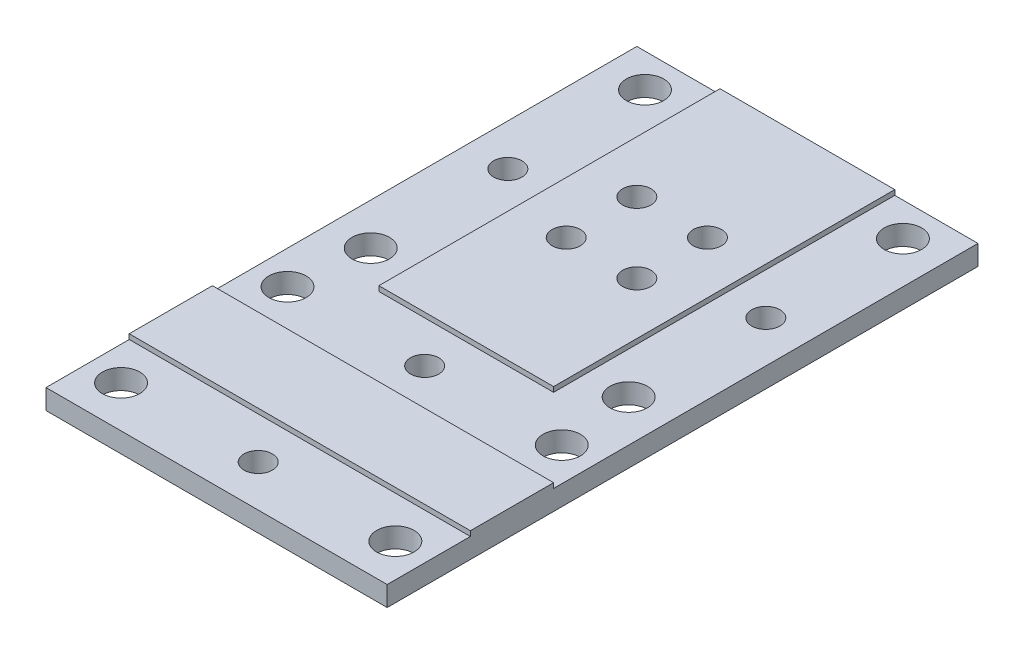
ISO-10303-21;
HEADER;
FILE_DESCRIPTION(('STEP AP214'),'2;1');
FILE_NAME('part.step','',(''),(''),'','','');
FILE_SCHEMA(('AUTOMOTIVE_DESIGN { 1 0 10303 214 1 1 1 1 }'));
ENDSEC;
DATA;
#1=APPLICATION_CONTEXT('core data for automotive mechanical design processes');
#2=APPLICATION_PROTOCOL_DEFINITION('international standard','automotive_design',2000,#1);
#3=PRODUCT_CONTEXT('',#1,'mechanical');
#4=PRODUCT('Part','Part','',(#3));
#5=PRODUCT_RELATED_PRODUCT_CATEGORY('part','',(#4));
#6=PRODUCT_DEFINITION_FORMATION('','',#4);
#7=PRODUCT_DEFINITION_CONTEXT('part definition',#1,'design');
#8=PRODUCT_DEFINITION('design','',#6,#7);
#9=PRODUCT_DEFINITION_SHAPE('','',#8);
#10=(LENGTH_UNIT() NAMED_UNIT(*) SI_UNIT(.MILLI.,.METRE.));
#11=(NAMED_UNIT(*) PLANE_ANGLE_UNIT() SI_UNIT($,.RADIAN.));
#12=(NAMED_UNIT(*) SI_UNIT($,.STERADIAN.) SOLID_ANGLE_UNIT());
#13=UNCERTAINTY_MEASURE_WITH_UNIT(LENGTH_MEASURE(1.E-05),#10,'distance_accuracy_value','');
#14=(GEOMETRIC_REPRESENTATION_CONTEXT(3) GLOBAL_UNCERTAINTY_ASSIGNED_CONTEXT((#13)) GLOBAL_UNIT_ASSIGNED_CONTEXT((#10,
#11,#12)) REPRESENTATION_CONTEXT('',''));
#15=CARTESIAN_POINT('',(0.,0.,0.));
#16=DIRECTION('',(0.,0.,1.));
#17=DIRECTION('',(1.,0.,0.));
#18=AXIS2_PLACEMENT_3D('',#15,#16,#17);
#19=CARTESIAN_POINT('',(0.,3.,0.));
#20=DIRECTION('',(0.,-1.,0.));
#21=DIRECTION('',(0.,0.,-1.));
#22=AXIS2_PLACEMENT_3D('',#19,#20,#21);
#23=PLANE('',#22);
#24=CARTESIAN_POINT('',(16.2573593128808,3.,-46.2573593128808));
#25=DIRECTION('',(0.,1.,0.));
#26=DIRECTION('',(0.,0.,1.));
#27=AXIS2_PLACEMENT_3D('',#24,#25,#26);
#28=CIRCLE('',#27,1.69999999999999);
#29=CARTESIAN_POINT('',(16.2573593128808,3.,-44.5573593128808));
#30=VERTEX_POINT('',#29);
#31=EDGE_CURVE('E441',#30,#30,#28,.T.);
#32=ORIENTED_EDGE('',*,*,#31,.F.);
#33=EDGE_LOOP('',(#32));
#34=FACE_BOUND('',#33,.T.);
#35=CARTESIAN_POINT('',(16.2573593128807,3.,-54.7426406871193));
#36=DIRECTION('',(0.,1.,0.));
#37=DIRECTION('',(0.,0.,1.));
#38=AXIS2_PLACEMENT_3D('',#35,#36,#37);
#39=CIRCLE('',#38,1.69999999999999);
#40=CARTESIAN_POINT('',(16.2573593128807,3.,-53.0426406871193));
#41=VERTEX_POINT('',#40);
#42=EDGE_CURVE('E443',#41,#41,#39,.T.);
#43=ORIENTED_EDGE('',*,*,#42,.F.);
#44=EDGE_LOOP('',(#43));
#45=FACE_BOUND('',#44,.T.);
#46=CARTESIAN_POINT('',(24.7426406871193,3.,-54.7426406871194));
#47=DIRECTION('',(0.,1.,0.));
#48=DIRECTION('',(0.,0.,1.));
#49=AXIS2_PLACEMENT_3D('',#46,#47,#48);
#50=CIRCLE('',#49,1.69999999999999);
#51=CARTESIAN_POINT('',(24.7426406871193,3.,-53.0426406871194));
#52=VERTEX_POINT('',#51);
#53=EDGE_CURVE('E451',#52,#52,#50,.T.);
#54=ORIENTED_EDGE('',*,*,#53,.F.);
#55=EDGE_LOOP('',(#54));
#56=FACE_BOUND('',#55,.T.);
#57=CARTESIAN_POINT('',(24.7426406871194,3.,-46.2573593128808));
#58=DIRECTION('',(0.,1.,0.));
#59=DIRECTION('',(0.,0.,1.));
#60=AXIS2_PLACEMENT_3D('',#57,#58,#59);
#61=CIRCLE('',#60,1.69999999999999);
#62=CARTESIAN_POINT('',(24.7426406871194,3.,-44.5573593128808));
#63=VERTEX_POINT('',#62);
#64=EDGE_CURVE('E457',#63,#63,#61,.T.);
#65=ORIENTED_EDGE('',*,*,#64,.F.);
#66=EDGE_LOOP('',(#65));
#67=FACE_BOUND('',#66,.T.);
#68=DIRECTION('',(-1.,0.,0.));
#69=VECTOR('',#68,1.);
#70=CARTESIAN_POINT('',(0.,3.,-71.));
#71=LINE('',#70,#69);
#72=CARTESIAN_POINT('',(31.,3.,-71.));
#73=VERTEX_POINT('',#72);
#74=CARTESIAN_POINT('',(10.,3.,-71.));
#75=VERTEX_POINT('',#74);
#76=EDGE_CURVE('E175',#73,#75,#71,.T.);
#77=ORIENTED_EDGE('',*,*,#76,.T.);
#78=DIRECTION('',(0.,0.,-1.));
#79=VECTOR('',#78,1.);
#80=CARTESIAN_POINT('',(10.,3.,-71.));
#81=LINE('',#80,#79);
#82=CARTESIAN_POINT('',(10.,3.,-30.));
#83=VERTEX_POINT('',#82);
#84=EDGE_CURVE('E137',#83,#75,#81,.T.);
#85=ORIENTED_EDGE('',*,*,#84,.F.);
#86=DIRECTION('',(-1.,0.,0.));
#87=VECTOR('',#86,1.);
#88=CARTESIAN_POINT('',(31.,3.,-30.));
#89=LINE('',#88,#87);
#90=CARTESIAN_POINT('',(31.,3.,-30.));
#91=VERTEX_POINT('',#90);
#92=EDGE_CURVE('E282',#91,#83,#89,.T.);
#93=ORIENTED_EDGE('',*,*,#92,.F.);
#94=DIRECTION('',(0.,0.,1.));
#95=VECTOR('',#94,1.);
#96=CARTESIAN_POINT('',(31.,3.,-71.));
#97=LINE('',#96,#95);
#98=EDGE_CURVE('E279',#73,#91,#97,.T.);
#99=ORIENTED_EDGE('',*,*,#98,.F.);
#100=EDGE_LOOP('',(#77,#85,#93,#99));
#101=FACE_BOUND('',#100,.T.);
#102=ADVANCED_FACE('F35',(#34,#45,#56,#67,#101),#23,.F.);
#103=CARTESIAN_POINT('',(0.,3.,0.));
#104=DIRECTION('',(1.,0.,0.));
#105=DIRECTION('',(0.,0.,-1.));
#106=AXIS2_PLACEMENT_3D('',#103,#104,#105);
#107=PLANE('',#106);
#108=DIRECTION('',(0.,0.,1.));
#109=VECTOR('',#108,1.);
#110=CARTESIAN_POINT('',(0.,3.,0.));
#111=LINE('',#110,#109);
#112=CARTESIAN_POINT('',(0.,3.,-20.));
#113=VERTEX_POINT('',#112);
#114=CARTESIAN_POINT('',(0.,3.,-9.99999999999999));
#115=VERTEX_POINT('',#114);
#116=EDGE_CURVE('E146',#113,#115,#111,.T.);
#117=ORIENTED_EDGE('',*,*,#116,.F.);
#118=DIRECTION('',(0.,1.,0.));
#119=VECTOR('',#118,1.);
#120=CARTESIAN_POINT('',(0.,2.4,-20.));
#121=LINE('',#120,#119);
#122=CARTESIAN_POINT('',(0.,2.4,-20.));
#123=VERTEX_POINT('',#122);
#124=EDGE_CURVE('E52',#123,#113,#121,.T.);
#125=ORIENTED_EDGE('',*,*,#124,.F.);
#126=DIRECTION('',(0.,0.,1.));
#127=VECTOR('',#126,1.);
#128=CARTESIAN_POINT('',(0.,2.4,-30.));
#129=LINE('',#128,#127);
#130=CARTESIAN_POINT('',(0.,2.4,-71.));
#131=VERTEX_POINT('',#130);
#132=EDGE_CURVE('E128',#131,#123,#129,.T.);
#133=ORIENTED_EDGE('',*,*,#132,.F.);
#134=DIRECTION('',(0.,-1.,0.));
#135=VECTOR('',#134,1.);
#136=CARTESIAN_POINT('',(0.,3.,-71.));
#137=LINE('',#136,#135);
#138=CARTESIAN_POINT('',(0.,0.,-71.));
#139=VERTEX_POINT('',#138);
#140=EDGE_CURVE('E178',#131,#139,#137,.T.);
#141=ORIENTED_EDGE('',*,*,#140,.T.);
#142=DIRECTION('',(0.,0.,1.));
#143=VECTOR('',#142,1.);
#144=CARTESIAN_POINT('',(0.,0.,0.));
#145=LINE('',#144,#143);
#146=CARTESIAN_POINT('',(0.,0.,0.));
#147=VERTEX_POINT('',#146);
#148=EDGE_CURVE('E168',#139,#147,#145,.T.);
#149=ORIENTED_EDGE('',*,*,#148,.T.);
#150=DIRECTION('',(0.,-1.,0.));
#151=VECTOR('',#150,1.);
#152=CARTESIAN_POINT('',(0.,3.,0.));
#153=LINE('',#152,#151);
#154=CARTESIAN_POINT('',(0.,2.4,0.));
#155=VERTEX_POINT('',#154);
#156=EDGE_CURVE('E11',#155,#147,#153,.T.);
#157=ORIENTED_EDGE('',*,*,#156,.F.);
#158=DIRECTION('',(0.,0.,1.));
#159=VECTOR('',#158,1.);
#160=CARTESIAN_POINT('',(0.,2.4,0.));
#161=LINE('',#160,#159);
#162=CARTESIAN_POINT('',(0.,2.4,-9.99999999999999));
#163=VERTEX_POINT('',#162);
#164=EDGE_CURVE('E154',#163,#155,#161,.T.);
#165=ORIENTED_EDGE('',*,*,#164,.F.);
#166=DIRECTION('',(0.,1.,0.));
#167=VECTOR('',#166,1.);
#168=CARTESIAN_POINT('',(0.,2.4,-9.99999999999999));
#169=LINE('',#168,#167);
#170=EDGE_CURVE('E166',#163,#115,#169,.T.);
#171=ORIENTED_EDGE('',*,*,#170,.T.);
#172=EDGE_LOOP('',(#117,#125,#133,#141,#149,#157,#165,#171));
#173=FACE_BOUND('',#172,.T.);
#174=ADVANCED_FACE('F37',(#173),#107,.F.);
#175=CARTESIAN_POINT('',(0.,3.,0.));
#176=DIRECTION('',(0.,0.,-1.));
#177=DIRECTION('',(-1.,0.,0.));
#178=AXIS2_PLACEMENT_3D('',#175,#176,#177);
#179=PLANE('',#178);
#180=DIRECTION('',(0.,-1.,0.));
#181=VECTOR('',#180,1.);
#182=CARTESIAN_POINT('',(41.,3.,0.));
#183=LINE('',#182,#181);
#184=CARTESIAN_POINT('',(41.,2.4,0.));
#185=VERTEX_POINT('',#184);
#186=CARTESIAN_POINT('',(41.,0.,0.));
#187=VERTEX_POINT('',#186);
#188=EDGE_CURVE('E44',#185,#187,#183,.T.);
#189=ORIENTED_EDGE('',*,*,#188,.F.);
#190=DIRECTION('',(1.,0.,0.));
#191=VECTOR('',#190,1.);
#192=CARTESIAN_POINT('',(41.,2.4,0.));
#193=LINE('',#192,#191);
#194=EDGE_CURVE('E156',#155,#185,#193,.T.);
#195=ORIENTED_EDGE('',*,*,#194,.F.);
#196=ORIENTED_EDGE('',*,*,#156,.T.);
#197=DIRECTION('',(1.,0.,0.));
#198=VECTOR('',#197,1.);
#199=CARTESIAN_POINT('',(0.,0.,0.));
#200=LINE('',#199,#198);
#201=EDGE_CURVE('E181',#147,#187,#200,.T.);
#202=ORIENTED_EDGE('',*,*,#201,.T.);
#203=EDGE_LOOP('',(#189,#195,#196,#202));
#204=FACE_BOUND('',#203,.T.);
#205=ADVANCED_FACE('F324',(#204),#179,.F.);
#206=CARTESIAN_POINT('',(41.,3.,0.));
#207=DIRECTION('',(-1.,0.,0.));
#208=DIRECTION('',(0.,0.,1.));
#209=AXIS2_PLACEMENT_3D('',#206,#207,#208);
#210=PLANE('',#209);
#211=DIRECTION('',(0.,0.,-1.));
#212=VECTOR('',#211,1.);
#213=CARTESIAN_POINT('',(41.,2.4,-20.));
#214=LINE('',#213,#212);
#215=CARTESIAN_POINT('',(41.,2.4,-20.));
#216=VERTEX_POINT('',#215);
#217=CARTESIAN_POINT('',(41.,2.4,-71.));
#218=VERTEX_POINT('',#217);
#219=EDGE_CURVE('E142',#216,#218,#214,.T.);
#220=ORIENTED_EDGE('',*,*,#219,.F.);
#221=DIRECTION('',(0.,1.,0.));
#222=VECTOR('',#221,1.);
#223=CARTESIAN_POINT('',(41.,2.4,-20.));
#224=LINE('',#223,#222);
#225=CARTESIAN_POINT('',(41.,3.,-20.));
#226=VERTEX_POINT('',#225);
#227=EDGE_CURVE('E141',#216,#226,#224,.T.);
#228=ORIENTED_EDGE('',*,*,#227,.T.);
#229=DIRECTION('',(0.,0.,-1.));
#230=VECTOR('',#229,1.);
#231=CARTESIAN_POINT('',(41.,3.,0.));
#232=LINE('',#231,#230);
#233=CARTESIAN_POINT('',(41.,3.,-9.99999999999999));
#234=VERTEX_POINT('',#233);
#235=EDGE_CURVE('E171',#234,#226,#232,.T.);
#236=ORIENTED_EDGE('',*,*,#235,.F.);
#237=DIRECTION('',(0.,1.,0.));
#238=VECTOR('',#237,1.);
#239=CARTESIAN_POINT('',(41.,2.4,-9.99999999999999));
#240=LINE('',#239,#238);
#241=CARTESIAN_POINT('',(41.,2.4,-9.99999999999999));
#242=VERTEX_POINT('',#241);
#243=EDGE_CURVE('E60',#242,#234,#240,.T.);
#244=ORIENTED_EDGE('',*,*,#243,.F.);
#245=DIRECTION('',(0.,0.,-1.));
#246=VECTOR('',#245,1.);
#247=CARTESIAN_POINT('',(41.,2.4,-9.99999999999999));
#248=LINE('',#247,#246);
#249=EDGE_CURVE('E159',#185,#242,#248,.T.);
#250=ORIENTED_EDGE('',*,*,#249,.F.);
#251=ORIENTED_EDGE('',*,*,#188,.T.);
#252=DIRECTION('',(0.,0.,-1.));
#253=VECTOR('',#252,1.);
#254=CARTESIAN_POINT('',(41.,0.,0.));
#255=LINE('',#254,#253);
#256=CARTESIAN_POINT('',(41.,0.,-71.));
#257=VERTEX_POINT('',#256);
#258=EDGE_CURVE('E184',#187,#257,#255,.T.);
#259=ORIENTED_EDGE('',*,*,#258,.T.);
#260=DIRECTION('',(0.,-1.,0.));
#261=VECTOR('',#260,1.);
#262=CARTESIAN_POINT('',(41.,3.,-71.));
#263=LINE('',#262,#261);
#264=EDGE_CURVE('E190',#218,#257,#263,.T.);
#265=ORIENTED_EDGE('',*,*,#264,.F.);
#266=EDGE_LOOP('',(#220,#228,#236,#244,#250,#251,#259,#265));
#267=FACE_BOUND('',#266,.T.);
#268=ADVANCED_FACE('F338',(#267),#210,.F.);
#269=CARTESIAN_POINT('',(0.,3.,-71.));
#270=DIRECTION('',(0.,0.,1.));
#271=DIRECTION('',(1.,0.,0.));
#272=AXIS2_PLACEMENT_3D('',#269,#270,#271);
#273=PLANE('',#272);
#274=DIRECTION('',(-1.,0.,0.));
#275=VECTOR('',#274,1.);
#276=CARTESIAN_POINT('',(0.,2.4,-71.));
#277=LINE('',#276,#275);
#278=CARTESIAN_POINT('',(10.,2.4,-71.));
#279=VERTEX_POINT('',#278);
#280=EDGE_CURVE('E134',#279,#131,#277,.T.);
#281=ORIENTED_EDGE('',*,*,#280,.F.);
#282=DIRECTION('',(0.,1.,0.));
#283=VECTOR('',#282,1.);
#284=CARTESIAN_POINT('',(10.,2.4,-71.));
#285=LINE('',#284,#283);
#286=EDGE_CURVE('E165',#279,#75,#285,.T.);
#287=ORIENTED_EDGE('',*,*,#286,.T.);
#288=ORIENTED_EDGE('',*,*,#76,.F.);
#289=DIRECTION('',(0.,1.,0.));
#290=VECTOR('',#289,1.);
#291=CARTESIAN_POINT('',(31.,2.4,-71.));
#292=LINE('',#291,#290);
#293=CARTESIAN_POINT('',(31.,2.4,-71.));
#294=VERTEX_POINT('',#293);
#295=EDGE_CURVE('E148',#294,#73,#292,.T.);
#296=ORIENTED_EDGE('',*,*,#295,.F.);
#297=DIRECTION('',(-1.,0.,0.));
#298=VECTOR('',#297,1.);
#299=CARTESIAN_POINT('',(41.,2.4,-71.));
#300=LINE('',#299,#298);
#301=EDGE_CURVE('E268',#218,#294,#300,.T.);
#302=ORIENTED_EDGE('',*,*,#301,.F.);
#303=ORIENTED_EDGE('',*,*,#264,.T.);
#304=DIRECTION('',(-1.,0.,0.));
#305=VECTOR('',#304,1.);
#306=CARTESIAN_POINT('',(0.,0.,-71.));
#307=LINE('',#306,#305);
#308=EDGE_CURVE('E172',#257,#139,#307,.T.);
#309=ORIENTED_EDGE('',*,*,#308,.T.);
#310=ORIENTED_EDGE('',*,*,#140,.F.);
#311=EDGE_LOOP('',(#281,#287,#288,#296,#302,#303,#309,#310));
#312=FACE_BOUND('',#311,.T.);
#313=ADVANCED_FACE('F301',(#312),#273,.F.);
#314=ORIENTED_EDGE('',*,*,#235,.T.);
#315=DIRECTION('',(1.,0.,0.));
#316=VECTOR('',#315,1.);
#317=CARTESIAN_POINT('',(0.,3.,-20.));
#318=LINE('',#317,#316);
#319=EDGE_CURVE('E196',#113,#226,#318,.T.);
#320=ORIENTED_EDGE('',*,*,#319,.F.);
#321=ORIENTED_EDGE('',*,*,#116,.T.);
#322=DIRECTION('',(-1.,0.,0.));
#323=VECTOR('',#322,1.);
#324=CARTESIAN_POINT('',(0.,3.,-9.99999999999999));
#325=LINE('',#324,#323);
#326=EDGE_CURVE('E157',#234,#115,#325,.T.);
#327=ORIENTED_EDGE('',*,*,#326,.F.);
#328=EDGE_LOOP('',(#314,#320,#321,#327));
#329=FACE_BOUND('',#328,.T.);
#330=ADVANCED_FACE('F320',(#329),#23,.F.);
#331=CARTESIAN_POINT('',(0.,0.,0.));
#332=DIRECTION('',(0.,-1.,0.));
#333=DIRECTION('',(0.,0.,-1.));
#334=AXIS2_PLACEMENT_3D('',#331,#332,#333);
#335=PLANE('',#334);
#336=CARTESIAN_POINT('',(16.2573593128808,0.,-46.2573593128808));
#337=DIRECTION('',(0.,1.,0.));
#338=DIRECTION('',(0.,0.,1.));
#339=AXIS2_PLACEMENT_3D('',#336,#337,#338);
#340=CIRCLE('',#339,1.7);
#341=CARTESIAN_POINT('',(16.2573593128808,0.,-44.5573593128808));
#342=VERTEX_POINT('',#341);
#343=EDGE_CURVE('E439',#342,#342,#340,.T.);
#344=ORIENTED_EDGE('',*,*,#343,.T.);
#345=EDGE_LOOP('',(#344));
#346=FACE_BOUND('',#345,.T.);
#347=CARTESIAN_POINT('',(16.2573593128807,0.,-54.7426406871193));
#348=DIRECTION('',(0.,1.,0.));
#349=DIRECTION('',(0.,0.,1.));
#350=AXIS2_PLACEMENT_3D('',#347,#348,#349);
#351=CIRCLE('',#350,1.7);
#352=CARTESIAN_POINT('',(16.2573593128807,0.,-53.0426406871193));
#353=VERTEX_POINT('',#352);
#354=EDGE_CURVE('E448',#353,#353,#351,.T.);
#355=ORIENTED_EDGE('',*,*,#354,.T.);
#356=EDGE_LOOP('',(#355));
#357=FACE_BOUND('',#356,.T.);
#358=CARTESIAN_POINT('',(24.7426406871193,0.,-54.7426406871194));
#359=DIRECTION('',(0.,1.,0.));
#360=DIRECTION('',(0.,0.,1.));
#361=AXIS2_PLACEMENT_3D('',#358,#359,#360);
#362=CIRCLE('',#361,1.7);
#363=CARTESIAN_POINT('',(24.7426406871193,0.,-53.0426406871194));
#364=VERTEX_POINT('',#363);
#365=EDGE_CURVE('E454',#364,#364,#362,.T.);
#366=ORIENTED_EDGE('',*,*,#365,.T.);
#367=EDGE_LOOP('',(#366));
#368=FACE_BOUND('',#367,.T.);
#369=CARTESIAN_POINT('',(24.7426406871194,0.,-46.2573593128808));
#370=DIRECTION('',(0.,1.,0.));
#371=DIRECTION('',(0.,0.,1.));
#372=AXIS2_PLACEMENT_3D('',#369,#370,#371);
#373=CIRCLE('',#372,1.7);
#374=CARTESIAN_POINT('',(24.7426406871194,0.,-44.5573593128808));
#375=VERTEX_POINT('',#374);
#376=EDGE_CURVE('E459',#375,#375,#373,.T.);
#377=ORIENTED_EDGE('',*,*,#376,.T.);
#378=EDGE_LOOP('',(#377));
#379=FACE_BOUND('',#378,.T.);
#380=CARTESIAN_POINT('',(20.5,0.,-5.));
#381=DIRECTION('',(0.,1.,0.));
#382=DIRECTION('',(0.,0.,1.));
#383=AXIS2_PLACEMENT_3D('',#380,#381,#382);
#384=CIRCLE('',#383,1.7);
#385=CARTESIAN_POINT('',(20.5,0.,-3.3));
#386=VERTEX_POINT('',#385);
#387=EDGE_CURVE('E239',#386,#386,#384,.T.);
#388=ORIENTED_EDGE('',*,*,#387,.T.);
#389=EDGE_LOOP('',(#388));
#390=FACE_BOUND('',#389,.T.);
#391=CARTESIAN_POINT('',(20.5,0.,-25.));
#392=DIRECTION('',(0.,1.,0.));
#393=DIRECTION('',(0.,0.,1.));
#394=AXIS2_PLACEMENT_3D('',#391,#392,#393);
#395=CIRCLE('',#394,1.7);
#396=CARTESIAN_POINT('',(20.5,0.,-23.3));
#397=VERTEX_POINT('',#396);
#398=EDGE_CURVE('E229',#397,#397,#395,.T.);
#399=ORIENTED_EDGE('',*,*,#398,.T.);
#400=EDGE_LOOP('',(#399));
#401=FACE_BOUND('',#400,.T.);
#402=CARTESIAN_POINT('',(4.99999999999999,0.,-50.5));
#403=DIRECTION('',(0.,1.,0.));
#404=DIRECTION('',(0.,0.,1.));
#405=AXIS2_PLACEMENT_3D('',#402,#403,#404);
#406=CIRCLE('',#405,1.7);
#407=CARTESIAN_POINT('',(4.99999999999999,0.,-48.8));
#408=VERTEX_POINT('',#407);
#409=EDGE_CURVE('E226',#408,#408,#406,.T.);
#410=ORIENTED_EDGE('',*,*,#409,.T.);
#411=EDGE_LOOP('',(#410));
#412=FACE_BOUND('',#411,.T.);
#413=CARTESIAN_POINT('',(36.,0.,-50.5));
#414=DIRECTION('',(0.,1.,0.));
#415=DIRECTION('',(0.,0.,1.));
#416=AXIS2_PLACEMENT_3D('',#413,#414,#415);
#417=CIRCLE('',#416,1.7);
#418=CARTESIAN_POINT('',(36.,0.,-48.8));
#419=VERTEX_POINT('',#418);
#420=EDGE_CURVE('E223',#419,#419,#417,.T.);
#421=ORIENTED_EDGE('',*,*,#420,.T.);
#422=EDGE_LOOP('',(#421));
#423=FACE_BOUND('',#422,.T.);
#424=CARTESIAN_POINT('',(4.02003210281144,0.,-5.));
#425=DIRECTION('',(0.,1.,0.));
#426=DIRECTION('',(0.,0.,1.));
#427=AXIS2_PLACEMENT_3D('',#424,#425,#426);
#428=CIRCLE('',#427,2.25);
#429=CARTESIAN_POINT('',(4.02003210281144,0.,-2.75));
#430=VERTEX_POINT('',#429);
#431=EDGE_CURVE('E219',#430,#430,#428,.T.);
#432=ORIENTED_EDGE('',*,*,#431,.T.);
#433=EDGE_LOOP('',(#432));
#434=FACE_BOUND('',#433,.T.);
#435=CARTESIAN_POINT('',(36.9799678971886,0.,-5.));
#436=DIRECTION('',(0.,1.,0.));
#437=DIRECTION('',(0.,0.,1.));
#438=AXIS2_PLACEMENT_3D('',#435,#436,#437);
#439=CIRCLE('',#438,2.25);
#440=CARTESIAN_POINT('',(36.9799678971886,0.,-2.75));
#441=VERTEX_POINT('',#440);
#442=EDGE_CURVE('E218',#441,#441,#439,.T.);
#443=ORIENTED_EDGE('',*,*,#442,.T.);
#444=EDGE_LOOP('',(#443));
#445=FACE_BOUND('',#444,.T.);
#446=CARTESIAN_POINT('',(36.9799678971886,0.,-25.));
#447=DIRECTION('',(0.,1.,0.));
#448=DIRECTION('',(0.,0.,1.));
#449=AXIS2_PLACEMENT_3D('',#446,#447,#448);
#450=CIRCLE('',#449,2.25);
#451=CARTESIAN_POINT('',(36.9799678971886,0.,-22.75));
#452=VERTEX_POINT('',#451);
#453=EDGE_CURVE('E214',#452,#452,#450,.T.);
#454=ORIENTED_EDGE('',*,*,#453,.T.);
#455=EDGE_LOOP('',(#454));
#456=FACE_BOUND('',#455,.T.);
#457=CARTESIAN_POINT('',(4.02003210281143,0.,-25.));
#458=DIRECTION('',(0.,1.,0.));
#459=DIRECTION('',(0.,0.,1.));
#460=AXIS2_PLACEMENT_3D('',#457,#458,#459);
#461=CIRCLE('',#460,2.25);
#462=CARTESIAN_POINT('',(4.02003210281143,0.,-22.75));
#463=VERTEX_POINT('',#462);
#464=EDGE_CURVE('E210',#463,#463,#461,.T.);
#465=ORIENTED_EDGE('',*,*,#464,.T.);
#466=EDGE_LOOP('',(#465));
#467=FACE_BOUND('',#466,.T.);
#468=CARTESIAN_POINT('',(4.99999999999999,0.,-34.0200321028114));
#469=DIRECTION('',(0.,1.,0.));
#470=DIRECTION('',(0.,0.,1.));
#471=AXIS2_PLACEMENT_3D('',#468,#469,#470);
#472=CIRCLE('',#471,2.25);
#473=CARTESIAN_POINT('',(4.99999999999999,0.,-31.7700321028114));
#474=VERTEX_POINT('',#473);
#475=EDGE_CURVE('E206',#474,#474,#472,.T.);
#476=ORIENTED_EDGE('',*,*,#475,.T.);
#477=EDGE_LOOP('',(#476));
#478=FACE_BOUND('',#477,.T.);
#479=CARTESIAN_POINT('',(36.,0.,-34.0200321028114));
#480=DIRECTION('',(0.,1.,0.));
#481=DIRECTION('',(0.,0.,1.));
#482=AXIS2_PLACEMENT_3D('',#479,#480,#481);
#483=CIRCLE('',#482,2.25);
#484=CARTESIAN_POINT('',(36.,0.,-31.7700321028114));
#485=VERTEX_POINT('',#484);
#486=EDGE_CURVE('E205',#485,#485,#483,.T.);
#487=ORIENTED_EDGE('',*,*,#486,.T.);
#488=EDGE_LOOP('',(#487));
#489=FACE_BOUND('',#488,.T.);
#490=CARTESIAN_POINT('',(36.,0.,-66.9799678971886));
#491=DIRECTION('',(0.,1.,0.));
#492=DIRECTION('',(0.,0.,1.));
#493=AXIS2_PLACEMENT_3D('',#490,#491,#492);
#494=CIRCLE('',#493,2.25);
#495=CARTESIAN_POINT('',(36.,0.,-64.7299678971886));
#496=VERTEX_POINT('',#495);
#497=EDGE_CURVE('E201',#496,#496,#494,.T.);
#498=ORIENTED_EDGE('',*,*,#497,.T.);
#499=EDGE_LOOP('',(#498));
#500=FACE_BOUND('',#499,.T.);
#501=CARTESIAN_POINT('',(4.99999999999999,0.,-66.9799678971885));
#502=DIRECTION('',(0.,1.,0.));
#503=DIRECTION('',(0.,0.,1.));
#504=AXIS2_PLACEMENT_3D('',#501,#502,#503);
#505=CIRCLE('',#504,2.25);
#506=CARTESIAN_POINT('',(4.99999999999999,0.,-64.7299678971885));
#507=VERTEX_POINT('',#506);
#508=EDGE_CURVE('E197',#507,#507,#505,.T.);
#509=ORIENTED_EDGE('',*,*,#508,.T.);
#510=EDGE_LOOP('',(#509));
#511=FACE_BOUND('',#510,.T.);
#512=ORIENTED_EDGE('',*,*,#148,.F.);
#513=ORIENTED_EDGE('',*,*,#308,.F.);
#514=ORIENTED_EDGE('',*,*,#258,.F.);
#515=ORIENTED_EDGE('',*,*,#201,.F.);
#516=EDGE_LOOP('',(#512,#513,#514,#515));
#517=FACE_BOUND('',#516,.T.);
#518=ADVANCED_FACE('F330',(#346,#357,#368,#379,#390,#401,#412,#423,#434,#445,#456,#467,#478,
#489,#500,#511,#517),#335,.T.);
#519=CARTESIAN_POINT('',(0.,2.4,-9.99999999999999));
#520=DIRECTION('',(0.,0.,-1.));
#521=DIRECTION('',(-1.,0.,0.));
#522=AXIS2_PLACEMENT_3D('',#519,#520,#521);
#523=PLANE('',#522);
#524=ORIENTED_EDGE('',*,*,#326,.T.);
#525=ORIENTED_EDGE('',*,*,#170,.F.);
#526=DIRECTION('',(-1.,0.,0.));
#527=VECTOR('',#526,1.);
#528=CARTESIAN_POINT('',(0.,2.4,-9.99999999999999));
#529=LINE('',#528,#527);
#530=EDGE_CURVE('E161',#242,#163,#529,.T.);
#531=ORIENTED_EDGE('',*,*,#530,.F.);
#532=ORIENTED_EDGE('',*,*,#243,.T.);
#533=EDGE_LOOP('',(#524,#525,#531,#532));
#534=FACE_BOUND('',#533,.T.);
#535=ADVANCED_FACE('F336',(#534),#523,.F.);
#536=CARTESIAN_POINT('',(0.,2.4,0.));
#537=DIRECTION('',(0.,-1.,0.));
#538=DIRECTION('',(0.,0.,-1.));
#539=AXIS2_PLACEMENT_3D('',#536,#537,#538);
#540=PLANE('',#539);
#541=CARTESIAN_POINT('',(20.5,2.4,-5.));
#542=DIRECTION('',(0.,-1.,0.));
#543=DIRECTION('',(0.,0.,-1.));
#544=AXIS2_PLACEMENT_3D('',#541,#542,#543);
#545=CIRCLE('',#544,1.69999999999999);
#546=CARTESIAN_POINT('',(20.5,2.4,-6.7));
#547=VERTEX_POINT('',#546);
#548=EDGE_CURVE('E39',#547,#547,#545,.T.);
#549=ORIENTED_EDGE('',*,*,#548,.T.);
#550=EDGE_LOOP('',(#549));
#551=FACE_BOUND('',#550,.T.);
#552=CARTESIAN_POINT('',(4.02003210281144,2.4,-5.));
#553=DIRECTION('',(0.,-1.,0.));
#554=DIRECTION('',(0.,0.,-1.));
#555=AXIS2_PLACEMENT_3D('',#552,#553,#554);
#556=CIRCLE('',#555,2.24999999999999);
#557=CARTESIAN_POINT('',(4.02003210281144,2.4,-7.24999999999999));
#558=VERTEX_POINT('',#557);
#559=EDGE_CURVE('E215',#558,#558,#556,.T.);
#560=ORIENTED_EDGE('',*,*,#559,.T.);
#561=EDGE_LOOP('',(#560));
#562=FACE_BOUND('',#561,.T.);
#563=CARTESIAN_POINT('',(36.9799678971886,2.4,-5.));
#564=DIRECTION('',(0.,-1.,0.));
#565=DIRECTION('',(0.,0.,-1.));
#566=AXIS2_PLACEMENT_3D('',#563,#564,#565);
#567=CIRCLE('',#566,2.25);
#568=CARTESIAN_POINT('',(36.9799678971886,2.4,-7.25));
#569=VERTEX_POINT('',#568);
#570=EDGE_CURVE('E249',#569,#569,#567,.T.);
#571=ORIENTED_EDGE('',*,*,#570,.T.);
#572=EDGE_LOOP('',(#571));
#573=FACE_BOUND('',#572,.T.);
#574=ORIENTED_EDGE('',*,*,#164,.T.);
#575=ORIENTED_EDGE('',*,*,#194,.T.);
#576=ORIENTED_EDGE('',*,*,#249,.T.);
#577=ORIENTED_EDGE('',*,*,#530,.T.);
#578=EDGE_LOOP('',(#574,#575,#576,#577));
#579=FACE_BOUND('',#578,.T.);
#580=ADVANCED_FACE('F315',(#551,#562,#573,#579),#540,.F.);
#581=CARTESIAN_POINT('',(10.,2.4,-71.));
#582=DIRECTION('',(1.,0.,0.));
#583=DIRECTION('',(0.,0.,-1.));
#584=AXIS2_PLACEMENT_3D('',#581,#582,#583);
#585=PLANE('',#584);
#586=ORIENTED_EDGE('',*,*,#84,.T.);
#587=ORIENTED_EDGE('',*,*,#286,.F.);
#588=DIRECTION('',(0.,0.,-1.));
#589=VECTOR('',#588,1.);
#590=CARTESIAN_POINT('',(10.,2.4,-71.));
#591=LINE('',#590,#589);
#592=CARTESIAN_POINT('',(10.,2.4,-30.));
#593=VERTEX_POINT('',#592);
#594=EDGE_CURVE('E150',#593,#279,#591,.T.);
#595=ORIENTED_EDGE('',*,*,#594,.F.);
#596=DIRECTION('',(0.,1.,0.));
#597=VECTOR('',#596,1.);
#598=CARTESIAN_POINT('',(10.,2.4,-30.));
#599=LINE('',#598,#597);
#600=EDGE_CURVE('E288',#593,#83,#599,.T.);
#601=ORIENTED_EDGE('',*,*,#600,.T.);
#602=EDGE_LOOP('',(#586,#587,#595,#601));
#603=FACE_BOUND('',#602,.T.);
#604=ADVANCED_FACE('F304',(#603),#585,.F.);
#605=CARTESIAN_POINT('',(31.,2.4,-30.));
#606=DIRECTION('',(0.,0.,-1.));
#607=DIRECTION('',(-1.,0.,0.));
#608=AXIS2_PLACEMENT_3D('',#605,#606,#607);
#609=PLANE('',#608);
#610=ORIENTED_EDGE('',*,*,#92,.T.);
#611=ORIENTED_EDGE('',*,*,#600,.F.);
#612=DIRECTION('',(-1.,0.,0.));
#613=VECTOR('',#612,1.);
#614=CARTESIAN_POINT('',(31.,2.4,-30.));
#615=LINE('',#614,#613);
#616=CARTESIAN_POINT('',(31.,2.4,-30.));
#617=VERTEX_POINT('',#616);
#618=EDGE_CURVE('E274',#617,#593,#615,.T.);
#619=ORIENTED_EDGE('',*,*,#618,.F.);
#620=DIRECTION('',(0.,1.,0.));
#621=VECTOR('',#620,1.);
#622=CARTESIAN_POINT('',(31.,2.4,-30.));
#623=LINE('',#622,#621);
#624=EDGE_CURVE('E290',#617,#91,#623,.T.);
#625=ORIENTED_EDGE('',*,*,#624,.T.);
#626=EDGE_LOOP('',(#610,#611,#619,#625));
#627=FACE_BOUND('',#626,.T.);
#628=ADVANCED_FACE('F307',(#627),#609,.F.);
#629=CARTESIAN_POINT('',(31.,2.4,-71.));
#630=DIRECTION('',(-1.,0.,0.));
#631=DIRECTION('',(0.,0.,1.));
#632=AXIS2_PLACEMENT_3D('',#629,#630,#631);
#633=PLANE('',#632);
#634=ORIENTED_EDGE('',*,*,#98,.T.);
#635=ORIENTED_EDGE('',*,*,#624,.F.);
#636=DIRECTION('',(0.,0.,1.));
#637=VECTOR('',#636,1.);
#638=CARTESIAN_POINT('',(31.,2.4,-71.));
#639=LINE('',#638,#637);
#640=EDGE_CURVE('E271',#294,#617,#639,.T.);
#641=ORIENTED_EDGE('',*,*,#640,.F.);
#642=ORIENTED_EDGE('',*,*,#295,.T.);
#643=EDGE_LOOP('',(#634,#635,#641,#642));
#644=FACE_BOUND('',#643,.T.);
#645=ADVANCED_FACE('F294',(#644),#633,.F.);
#646=CARTESIAN_POINT('',(0.,2.4,-20.));
#647=DIRECTION('',(0.,0.,1.));
#648=DIRECTION('',(1.,0.,0.));
#649=AXIS2_PLACEMENT_3D('',#646,#647,#648);
#650=PLANE('',#649);
#651=ORIENTED_EDGE('',*,*,#319,.T.);
#652=ORIENTED_EDGE('',*,*,#227,.F.);
#653=DIRECTION('',(1.,0.,0.));
#654=VECTOR('',#653,1.);
#655=CARTESIAN_POINT('',(0.,2.4,-20.));
#656=LINE('',#655,#654);
#657=EDGE_CURVE('E130',#123,#216,#656,.T.);
#658=ORIENTED_EDGE('',*,*,#657,.F.);
#659=ORIENTED_EDGE('',*,*,#124,.T.);
#660=EDGE_LOOP('',(#651,#652,#658,#659));
#661=FACE_BOUND('',#660,.T.);
#662=ADVANCED_FACE('F139',(#661),#650,.F.);
#663=CARTESIAN_POINT('',(0.,2.4,0.));
#664=DIRECTION('',(0.,-1.,0.));
#665=DIRECTION('',(0.,0.,-1.));
#666=AXIS2_PLACEMENT_3D('',#663,#664,#665);
#667=PLANE('',#666);
#668=CARTESIAN_POINT('',(20.5,2.4,-25.));
#669=DIRECTION('',(0.,-1.,0.));
#670=DIRECTION('',(0.,0.,-1.));
#671=AXIS2_PLACEMENT_3D('',#668,#669,#670);
#672=CIRCLE('',#671,1.69999999999999);
#673=CARTESIAN_POINT('',(20.5,2.4,-26.7));
#674=VERTEX_POINT('',#673);
#675=EDGE_CURVE('E227',#674,#674,#672,.T.);
#676=ORIENTED_EDGE('',*,*,#675,.T.);
#677=EDGE_LOOP('',(#676));
#678=FACE_BOUND('',#677,.T.);
#679=CARTESIAN_POINT('',(4.99999999999999,2.4,-50.5));
#680=DIRECTION('',(0.,-1.,0.));
#681=DIRECTION('',(0.,0.,-1.));
#682=AXIS2_PLACEMENT_3D('',#679,#680,#681);
#683=CIRCLE('',#682,1.69999999999999);
#684=CARTESIAN_POINT('',(4.99999999999999,2.4,-52.2));
#685=VERTEX_POINT('',#684);
#686=EDGE_CURVE('E224',#685,#685,#683,.T.);
#687=ORIENTED_EDGE('',*,*,#686,.T.);
#688=EDGE_LOOP('',(#687));
#689=FACE_BOUND('',#688,.T.);
#690=CARTESIAN_POINT('',(36.,2.4,-50.5));
#691=DIRECTION('',(0.,-1.,0.));
#692=DIRECTION('',(0.,0.,-1.));
#693=AXIS2_PLACEMENT_3D('',#690,#691,#692);
#694=CIRCLE('',#693,1.69999999999999);
#695=CARTESIAN_POINT('',(36.,2.4,-52.2));
#696=VERTEX_POINT('',#695);
#697=EDGE_CURVE('E220',#696,#696,#694,.T.);
#698=ORIENTED_EDGE('',*,*,#697,.T.);
#699=EDGE_LOOP('',(#698));
#700=FACE_BOUND('',#699,.T.);
#701=CARTESIAN_POINT('',(36.9799678971886,2.4,-25.));
#702=DIRECTION('',(0.,-1.,0.));
#703=DIRECTION('',(0.,0.,-1.));
#704=AXIS2_PLACEMENT_3D('',#701,#702,#703);
#705=CIRCLE('',#704,2.25);
#706=CARTESIAN_POINT('',(36.9799678971886,2.4,-27.25));
#707=VERTEX_POINT('',#706);
#708=EDGE_CURVE('E211',#707,#707,#705,.T.);
#709=ORIENTED_EDGE('',*,*,#708,.T.);
#710=EDGE_LOOP('',(#709));
#711=FACE_BOUND('',#710,.T.);
#712=CARTESIAN_POINT('',(4.02003210281143,2.4,-25.));
#713=DIRECTION('',(0.,-1.,0.));
#714=DIRECTION('',(0.,0.,-1.));
#715=AXIS2_PLACEMENT_3D('',#712,#713,#714);
#716=CIRCLE('',#715,2.24999999999999);
#717=CARTESIAN_POINT('',(4.02003210281143,2.4,-27.25));
#718=VERTEX_POINT('',#717);
#719=EDGE_CURVE('E207',#718,#718,#716,.T.);
#720=ORIENTED_EDGE('',*,*,#719,.T.);
#721=EDGE_LOOP('',(#720));
#722=FACE_BOUND('',#721,.T.);
#723=CARTESIAN_POINT('',(4.99999999999999,2.4,-34.0200321028114));
#724=DIRECTION('',(0.,-1.,0.));
#725=DIRECTION('',(0.,0.,-1.));
#726=AXIS2_PLACEMENT_3D('',#723,#724,#725);
#727=CIRCLE('',#726,2.24999999999999);
#728=CARTESIAN_POINT('',(4.99999999999999,2.4,-36.2700321028114));
#729=VERTEX_POINT('',#728);
#730=EDGE_CURVE('E202',#729,#729,#727,.T.);
#731=ORIENTED_EDGE('',*,*,#730,.T.);
#732=EDGE_LOOP('',(#731));
#733=FACE_BOUND('',#732,.T.);
#734=CARTESIAN_POINT('',(36.,2.4,-34.0200321028114));
#735=DIRECTION('',(0.,-1.,0.));
#736=DIRECTION('',(0.,0.,-1.));
#737=AXIS2_PLACEMENT_3D('',#734,#735,#736);
#738=CIRCLE('',#737,2.25);
#739=CARTESIAN_POINT('',(36.,2.4,-36.2700321028114));
#740=VERTEX_POINT('',#739);
#741=EDGE_CURVE('E260',#740,#740,#738,.T.);
#742=ORIENTED_EDGE('',*,*,#741,.T.);
#743=EDGE_LOOP('',(#742));
#744=FACE_BOUND('',#743,.T.);
#745=CARTESIAN_POINT('',(36.,2.4,-66.9799678971886));
#746=DIRECTION('',(0.,-1.,0.));
#747=DIRECTION('',(0.,0.,-1.));
#748=AXIS2_PLACEMENT_3D('',#745,#746,#747);
#749=CIRCLE('',#748,2.25);
#750=CARTESIAN_POINT('',(36.,2.4,-69.2299678971885));
#751=VERTEX_POINT('',#750);
#752=EDGE_CURVE('E198',#751,#751,#749,.T.);
#753=ORIENTED_EDGE('',*,*,#752,.T.);
#754=EDGE_LOOP('',(#753));
#755=FACE_BOUND('',#754,.T.);
#756=CARTESIAN_POINT('',(4.99999999999999,2.4,-66.9799678971885));
#757=DIRECTION('',(0.,-1.,0.));
#758=DIRECTION('',(0.,0.,-1.));
#759=AXIS2_PLACEMENT_3D('',#756,#757,#758);
#760=CIRCLE('',#759,2.24999999999999);
#761=CARTESIAN_POINT('',(4.99999999999999,2.4,-69.2299678971885));
#762=VERTEX_POINT('',#761);
#763=EDGE_CURVE('E193',#762,#762,#760,.T.);
#764=ORIENTED_EDGE('',*,*,#763,.T.);
#765=EDGE_LOOP('',(#764));
#766=FACE_BOUND('',#765,.T.);
#767=ORIENTED_EDGE('',*,*,#132,.T.);
#768=ORIENTED_EDGE('',*,*,#657,.T.);
#769=ORIENTED_EDGE('',*,*,#219,.T.);
#770=ORIENTED_EDGE('',*,*,#301,.T.);
#771=ORIENTED_EDGE('',*,*,#640,.T.);
#772=ORIENTED_EDGE('',*,*,#618,.T.);
#773=ORIENTED_EDGE('',*,*,#594,.T.);
#774=ORIENTED_EDGE('',*,*,#280,.T.);
#775=EDGE_LOOP('',(#767,#768,#769,#770,#771,#772,#773,#774));
#776=FACE_BOUND('',#775,.T.);
#777=ADVANCED_FACE('F129',(#678,#689,#700,#711,#722,#733,#744,#755,#766,#776),#667,.F.);
#778=CARTESIAN_POINT('',(4.99999999999999,3.,-66.9799678971885));
#779=DIRECTION('',(0.,1.,0.));
#780=DIRECTION('',(0.,0.,1.));
#781=AXIS2_PLACEMENT_3D('',#778,#779,#780);
#782=CYLINDRICAL_SURFACE('',#781,2.24999999999999);
#783=ORIENTED_EDGE('',*,*,#508,.F.);
#784=EDGE_LOOP('',(#783));
#785=FACE_BOUND('',#784,.T.);
#786=ORIENTED_EDGE('',*,*,#763,.F.);
#787=EDGE_LOOP('',(#786));
#788=FACE_BOUND('',#787,.T.);
#789=ADVANCED_FACE('F366',(#785,#788),#782,.F.);
#790=CARTESIAN_POINT('',(36.,3.,-66.9799678971886));
#791=DIRECTION('',(0.,1.,0.));
#792=DIRECTION('',(0.,0.,1.));
#793=AXIS2_PLACEMENT_3D('',#790,#791,#792);
#794=CYLINDRICAL_SURFACE('',#793,2.25);
#795=ORIENTED_EDGE('',*,*,#497,.F.);
#796=EDGE_LOOP('',(#795));
#797=FACE_BOUND('',#796,.T.);
#798=ORIENTED_EDGE('',*,*,#752,.F.);
#799=EDGE_LOOP('',(#798));
#800=FACE_BOUND('',#799,.T.);
#801=ADVANCED_FACE('F371',(#797,#800),#794,.F.);
#802=CARTESIAN_POINT('',(36.,3.,-34.0200321028114));
#803=DIRECTION('',(0.,1.,0.));
#804=DIRECTION('',(0.,0.,1.));
#805=AXIS2_PLACEMENT_3D('',#802,#803,#804);
#806=CYLINDRICAL_SURFACE('',#805,2.25);
#807=ORIENTED_EDGE('',*,*,#486,.F.);
#808=EDGE_LOOP('',(#807));
#809=FACE_BOUND('',#808,.T.);
#810=ORIENTED_EDGE('',*,*,#741,.F.);
#811=EDGE_LOOP('',(#810));
#812=FACE_BOUND('',#811,.T.);
#813=ADVANCED_FACE('F378',(#809,#812),#806,.F.);
#814=CARTESIAN_POINT('',(4.99999999999999,3.,-34.0200321028114));
#815=DIRECTION('',(0.,1.,0.));
#816=DIRECTION('',(0.,0.,1.));
#817=AXIS2_PLACEMENT_3D('',#814,#815,#816);
#818=CYLINDRICAL_SURFACE('',#817,2.24999999999999);
#819=ORIENTED_EDGE('',*,*,#475,.F.);
#820=EDGE_LOOP('',(#819));
#821=FACE_BOUND('',#820,.T.);
#822=ORIENTED_EDGE('',*,*,#730,.F.);
#823=EDGE_LOOP('',(#822));
#824=FACE_BOUND('',#823,.T.);
#825=ADVANCED_FACE('F382',(#821,#824),#818,.F.);
#826=CARTESIAN_POINT('',(4.02003210281143,3.,-25.));
#827=DIRECTION('',(0.,1.,0.));
#828=DIRECTION('',(0.,0.,1.));
#829=AXIS2_PLACEMENT_3D('',#826,#827,#828);
#830=CYLINDRICAL_SURFACE('',#829,2.24999999999999);
#831=ORIENTED_EDGE('',*,*,#464,.F.);
#832=EDGE_LOOP('',(#831));
#833=FACE_BOUND('',#832,.T.);
#834=ORIENTED_EDGE('',*,*,#719,.F.);
#835=EDGE_LOOP('',(#834));
#836=FACE_BOUND('',#835,.T.);
#837=ADVANCED_FACE('F386',(#833,#836),#830,.F.);
#838=CARTESIAN_POINT('',(36.9799678971886,3.,-25.));
#839=DIRECTION('',(0.,1.,0.));
#840=DIRECTION('',(0.,0.,1.));
#841=AXIS2_PLACEMENT_3D('',#838,#839,#840);
#842=CYLINDRICAL_SURFACE('',#841,2.25);
#843=ORIENTED_EDGE('',*,*,#453,.F.);
#844=EDGE_LOOP('',(#843));
#845=FACE_BOUND('',#844,.T.);
#846=ORIENTED_EDGE('',*,*,#708,.F.);
#847=EDGE_LOOP('',(#846));
#848=FACE_BOUND('',#847,.T.);
#849=ADVANCED_FACE('F390',(#845,#848),#842,.F.);
#850=CARTESIAN_POINT('',(36.9799678971886,3.,-5.));
#851=DIRECTION('',(0.,1.,0.));
#852=DIRECTION('',(0.,0.,1.));
#853=AXIS2_PLACEMENT_3D('',#850,#851,#852);
#854=CYLINDRICAL_SURFACE('',#853,2.25);
#855=ORIENTED_EDGE('',*,*,#442,.F.);
#856=EDGE_LOOP('',(#855));
#857=FACE_BOUND('',#856,.T.);
#858=ORIENTED_EDGE('',*,*,#570,.F.);
#859=EDGE_LOOP('',(#858));
#860=FACE_BOUND('',#859,.T.);
#861=ADVANCED_FACE('F394',(#857,#860),#854,.F.);
#862=CARTESIAN_POINT('',(4.02003210281144,3.,-5.));
#863=DIRECTION('',(0.,1.,0.));
#864=DIRECTION('',(0.,0.,1.));
#865=AXIS2_PLACEMENT_3D('',#862,#863,#864);
#866=CYLINDRICAL_SURFACE('',#865,2.24999999999999);
#867=ORIENTED_EDGE('',*,*,#431,.F.);
#868=EDGE_LOOP('',(#867));
#869=FACE_BOUND('',#868,.T.);
#870=ORIENTED_EDGE('',*,*,#559,.F.);
#871=EDGE_LOOP('',(#870));
#872=FACE_BOUND('',#871,.T.);
#873=ADVANCED_FACE('F398',(#869,#872),#866,.F.);
#874=CARTESIAN_POINT('',(36.,3.,-50.5));
#875=DIRECTION('',(0.,1.,0.));
#876=DIRECTION('',(0.,0.,1.));
#877=AXIS2_PLACEMENT_3D('',#874,#875,#876);
#878=CYLINDRICAL_SURFACE('',#877,1.69999999999999);
#879=ORIENTED_EDGE('',*,*,#420,.F.);
#880=EDGE_LOOP('',(#879));
#881=FACE_BOUND('',#880,.T.);
#882=ORIENTED_EDGE('',*,*,#697,.F.);
#883=EDGE_LOOP('',(#882));
#884=FACE_BOUND('',#883,.T.);
#885=ADVANCED_FACE('F402',(#881,#884),#878,.F.);
#886=CARTESIAN_POINT('',(4.99999999999999,3.,-50.5));
#887=DIRECTION('',(0.,1.,0.));
#888=DIRECTION('',(0.,0.,1.));
#889=AXIS2_PLACEMENT_3D('',#886,#887,#888);
#890=CYLINDRICAL_SURFACE('',#889,1.69999999999999);
#891=ORIENTED_EDGE('',*,*,#409,.F.);
#892=EDGE_LOOP('',(#891));
#893=FACE_BOUND('',#892,.T.);
#894=ORIENTED_EDGE('',*,*,#686,.F.);
#895=EDGE_LOOP('',(#894));
#896=FACE_BOUND('',#895,.T.);
#897=ADVANCED_FACE('F406',(#893,#896),#890,.F.);
#898=CARTESIAN_POINT('',(20.5,3.,-25.));
#899=DIRECTION('',(0.,1.,0.));
#900=DIRECTION('',(0.,0.,1.));
#901=AXIS2_PLACEMENT_3D('',#898,#899,#900);
#902=CYLINDRICAL_SURFACE('',#901,1.69999999999999);
#903=ORIENTED_EDGE('',*,*,#398,.F.);
#904=EDGE_LOOP('',(#903));
#905=FACE_BOUND('',#904,.T.);
#906=ORIENTED_EDGE('',*,*,#675,.F.);
#907=EDGE_LOOP('',(#906));
#908=FACE_BOUND('',#907,.T.);
#909=ADVANCED_FACE('F410',(#905,#908),#902,.F.);
#910=CARTESIAN_POINT('',(20.5,3.,-5.));
#911=DIRECTION('',(0.,1.,0.));
#912=DIRECTION('',(0.,0.,1.));
#913=AXIS2_PLACEMENT_3D('',#910,#911,#912);
#914=CYLINDRICAL_SURFACE('',#913,1.69999999999999);
#915=ORIENTED_EDGE('',*,*,#387,.F.);
#916=EDGE_LOOP('',(#915));
#917=FACE_BOUND('',#916,.T.);
#918=ORIENTED_EDGE('',*,*,#548,.F.);
#919=EDGE_LOOP('',(#918));
#920=FACE_BOUND('',#919,.T.);
#921=ADVANCED_FACE('F414',(#917,#920),#914,.F.);
#922=CARTESIAN_POINT('',(24.7426406871194,3.,-46.2573593128808));
#923=DIRECTION('',(0.,1.,0.));
#924=DIRECTION('',(0.,0.,1.));
#925=AXIS2_PLACEMENT_3D('',#922,#923,#924);
#926=CYLINDRICAL_SURFACE('',#925,1.69999999999999);
#927=ORIENTED_EDGE('',*,*,#376,.F.);
#928=EDGE_LOOP('',(#927));
#929=FACE_BOUND('',#928,.T.);
#930=ORIENTED_EDGE('',*,*,#64,.T.);
#931=EDGE_LOOP('',(#930));
#932=FACE_BOUND('',#931,.T.);
#933=ADVANCED_FACE('F418',(#929,#932),#926,.F.);
#934=CARTESIAN_POINT('',(24.7426406871193,3.,-54.7426406871194));
#935=DIRECTION('',(0.,1.,0.));
#936=DIRECTION('',(0.,0.,1.));
#937=AXIS2_PLACEMENT_3D('',#934,#935,#936);
#938=CYLINDRICAL_SURFACE('',#937,1.69999999999999);
#939=ORIENTED_EDGE('',*,*,#365,.F.);
#940=EDGE_LOOP('',(#939));
#941=FACE_BOUND('',#940,.T.);
#942=ORIENTED_EDGE('',*,*,#53,.T.);
#943=EDGE_LOOP('',(#942));
#944=FACE_BOUND('',#943,.T.);
#945=ADVANCED_FACE('F422',(#941,#944),#938,.F.);
#946=CARTESIAN_POINT('',(16.2573593128807,3.,-54.7426406871193));
#947=DIRECTION('',(0.,1.,0.));
#948=DIRECTION('',(0.,0.,1.));
#949=AXIS2_PLACEMENT_3D('',#946,#947,#948);
#950=CYLINDRICAL_SURFACE('',#949,1.69999999999999);
#951=ORIENTED_EDGE('',*,*,#354,.F.);
#952=EDGE_LOOP('',(#951));
#953=FACE_BOUND('',#952,.T.);
#954=ORIENTED_EDGE('',*,*,#42,.T.);
#955=EDGE_LOOP('',(#954));
#956=FACE_BOUND('',#955,.T.);
#957=ADVANCED_FACE('F426',(#953,#956),#950,.F.);
#958=CARTESIAN_POINT('',(16.2573593128808,3.,-46.2573593128808));
#959=DIRECTION('',(0.,1.,0.));
#960=DIRECTION('',(0.,0.,1.));
#961=AXIS2_PLACEMENT_3D('',#958,#959,#960);
#962=CYLINDRICAL_SURFACE('',#961,1.69999999999999);
#963=ORIENTED_EDGE('',*,*,#343,.F.);
#964=EDGE_LOOP('',(#963));
#965=FACE_BOUND('',#964,.T.);
#966=ORIENTED_EDGE('',*,*,#31,.T.);
#967=EDGE_LOOP('',(#966));
#968=FACE_BOUND('',#967,.T.);
#969=ADVANCED_FACE('F430',(#965,#968),#962,.F.);
#970=CLOSED_SHELL('',(#102,#174,#205,#268,#313,#330,#518,#535,#580,#604,#628,#645,#662,#777,
#789,#801,#813,#825,#837,#849,#861,#873,#885,#897,#909,#921,#933,#945,#957,#969));
#971=MANIFOLD_SOLID_BREP('B2',#970);
#972=ADVANCED_BREP_SHAPE_REPRESENTATION('',(#18,#971),#14);
#973=SHAPE_DEFINITION_REPRESENTATION(#9,#972);
ENDSEC;
END-ISO-10303-21;
